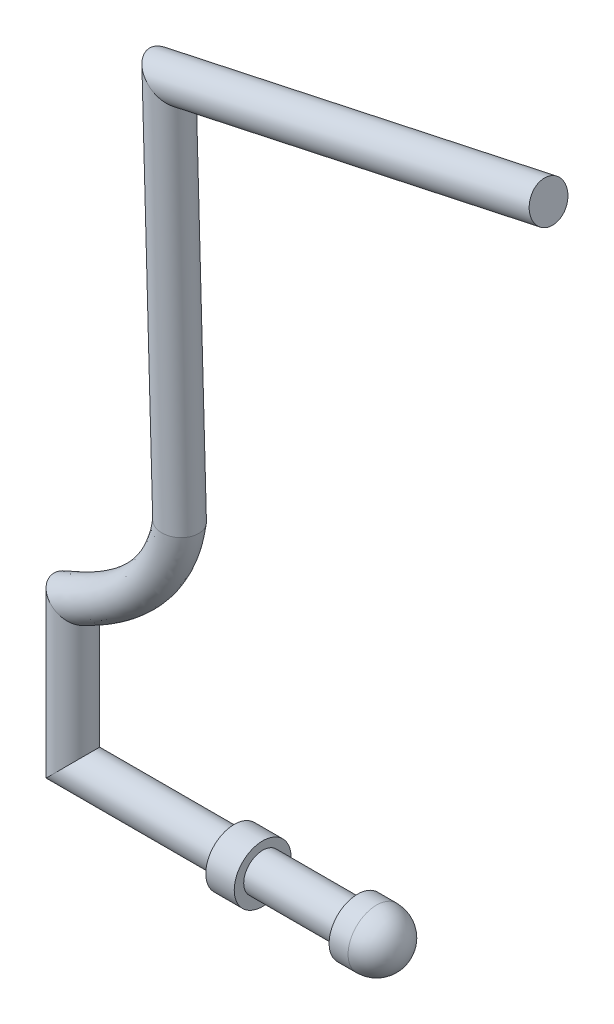
ISO-10303-21;
HEADER;
FILE_DESCRIPTION(('STEP AP214'),'2;1');
FILE_NAME('part.step','',(''),(''),'','','');
FILE_SCHEMA(('AUTOMOTIVE_DESIGN { 1 0 10303 214 1 1 1 1 }'));
ENDSEC;
DATA;
#1=APPLICATION_CONTEXT('core data for automotive mechanical design processes');
#2=APPLICATION_PROTOCOL_DEFINITION('international standard','automotive_design',2000,#1);
#3=PRODUCT_CONTEXT('',#1,'mechanical');
#4=PRODUCT('Part','Part','',(#3));
#5=PRODUCT_RELATED_PRODUCT_CATEGORY('part','',(#4));
#6=PRODUCT_DEFINITION_FORMATION('','',#4);
#7=PRODUCT_DEFINITION_CONTEXT('part definition',#1,'design');
#8=PRODUCT_DEFINITION('design','',#6,#7);
#9=PRODUCT_DEFINITION_SHAPE('','',#8);
#10=(LENGTH_UNIT() NAMED_UNIT(*) SI_UNIT(.MILLI.,.METRE.));
#11=(NAMED_UNIT(*) PLANE_ANGLE_UNIT() SI_UNIT($,.RADIAN.));
#12=(NAMED_UNIT(*) SI_UNIT($,.STERADIAN.) SOLID_ANGLE_UNIT());
#13=UNCERTAINTY_MEASURE_WITH_UNIT(LENGTH_MEASURE(1.E-05),#10,'distance_accuracy_value','');
#14=(GEOMETRIC_REPRESENTATION_CONTEXT(3) GLOBAL_UNCERTAINTY_ASSIGNED_CONTEXT((#13)) GLOBAL_UNIT_ASSIGNED_CONTEXT((#10,
#11,#12)) REPRESENTATION_CONTEXT('',''));
#15=CARTESIAN_POINT('',(0.,0.,0.));
#16=DIRECTION('',(0.,0.,1.));
#17=DIRECTION('',(1.,0.,0.));
#18=AXIS2_PLACEMENT_3D('',#15,#16,#17);
#19=CARTESIAN_POINT('',(23.0701537216067,32.6630947338033,0.));
#20=DIRECTION('',(0.977616807697375,0.210393387033894,0.));
#21=DIRECTION('',(0.,0.,1.));
#22=AXIS2_PLACEMENT_3D('',#19,#20,#21);
#23=PLANE('',#22);
#24=CARTESIAN_POINT('',(23.0701537216067,32.6630947338033,0.));
#25=DIRECTION('',(0.977616807697375,0.210393387033894,0.));
#26=DIRECTION('',(0.,0.,1.));
#27=AXIS2_PLACEMENT_3D('',#24,#25,#26);
#28=CIRCLE('',#27,2.);
#29=CARTESIAN_POINT('',(23.0701537216067,32.6630947338033,2.));
#30=VERTEX_POINT('',#29);
#31=EDGE_CURVE('E150',#30,#30,#28,.T.);
#32=ORIENTED_EDGE('',*,*,#31,.T.);
#33=EDGE_LOOP('',(#32));
#34=FACE_BOUND('',#33,.T.);
#35=ADVANCED_FACE('F57',(#34),#23,.T.);
#36=CARTESIAN_POINT('',(-31.5573984994964,-43.6047649305131,0.));
#37=DIRECTION('',(1.,0.,0.));
#38=DIRECTION('',(0.,0.,-1.));
#39=AXIS2_PLACEMENT_3D('',#36,#37,#38);
#40=CYLINDRICAL_SURFACE('',#39,2.);
#41=CARTESIAN_POINT('',(-10.0573984994964,-43.6047649305131,0.));
#42=DIRECTION('',(-1.,0.,0.));
#43=DIRECTION('',(0.,0.,1.));
#44=AXIS2_PLACEMENT_3D('',#41,#42,#43);
#45=CIRCLE('',#44,2.);
#46=CARTESIAN_POINT('',(-10.0573984994964,-43.6047649305131,2.));
#47=VERTEX_POINT('',#46);
#48=EDGE_CURVE('E61',#47,#47,#45,.T.);
#49=ORIENTED_EDGE('',*,*,#48,.T.);
#50=EDGE_LOOP('',(#49));
#51=FACE_BOUND('',#50,.T.);
#52=CARTESIAN_POINT('',(-27.0573984994964,-43.6047649305131,0.));
#53=DIRECTION('',(0.707106781186548,-0.707106781186547,0.));
#54=DIRECTION('',(-0.707106781186547,-0.707106781186548,0.));
#55=AXIS2_PLACEMENT_3D('',#52,#53,#54);
#56=ELLIPSE('',#55,2.82842712474619,2.);
#57=CARTESIAN_POINT('',(-29.0573984994964,-45.6047649305131,0.));
#58=VERTEX_POINT('',#57);
#59=EDGE_CURVE('E94',#58,#58,#56,.T.);
#60=ORIENTED_EDGE('',*,*,#59,.T.);
#61=EDGE_LOOP('',(#60));
#62=FACE_BOUND('',#61,.T.);
#63=ADVANCED_FACE('F175',(#51,#62),#40,.T.);
#64=CARTESIAN_POINT('',(-27.0573984994964,-25.6304125318188,0.));
#65=DIRECTION('',(0.,-1.,0.));
#66=DIRECTION('',(1.,0.,0.));
#67=AXIS2_PLACEMENT_3D('',#64,#65,#66);
#68=CYLINDRICAL_SURFACE('',#67,2.);
#69=CARTESIAN_POINT('',(-27.0573984994964,-28.6047649305131,2.));
#70=CARTESIAN_POINT('',(-27.0547902427945,-28.60646879431,2.00000000374567));
#71=CARTESIAN_POINT('',(-27.052181816219,-28.6081726236316,1.99999490133649));
#72=CARTESIAN_POINT('',(-26.9073391187785,-28.7027760905828,1.99942798150484));
#73=CARTESIAN_POINT('',(-26.7646487444797,-28.7955419600589,1.9836860106137));
#74=CARTESIAN_POINT('',(-26.4831926961601,-28.9777032569447,1.92123246162214));
#75=CARTESIAN_POINT('',(-26.3444421868484,-29.0670860125427,1.87441469037574));
#76=CARTESIAN_POINT('',(-26.1497182514312,-29.1920074472056,1.7834437351073));
#77=CARTESIAN_POINT('',(-26.0896780176796,-29.2304476947069,1.75162705490688));
#78=CARTESIAN_POINT('',(-25.9723056254477,-29.3054523551176,1.68144115418145));
#79=CARTESIAN_POINT('',(-25.9149727400399,-29.3420172717862,1.64307370546662));
#80=CARTESIAN_POINT('',(-25.8038819226971,-29.4127436319745,1.55996553468224));
#81=CARTESIAN_POINT('',(-25.7501130749828,-29.4469124348001,1.51524573004768));
#82=CARTESIAN_POINT('',(-25.6466503479311,-29.5125543433953,1.41942520351881));
#83=CARTESIAN_POINT('',(-25.5969607783853,-29.5440245996507,1.36831787331346));
#84=CARTESIAN_POINT('',(-25.4831641588429,-29.615991037872,1.23775721054097));
#85=CARTESIAN_POINT('',(-25.4214845808273,-29.6549067352617,1.15526586345115));
#86=CARTESIAN_POINT('',(-25.3105071123684,-29.7248124596385,0.979360181860293));
#87=CARTESIAN_POINT('',(-25.2611923278417,-29.7558133018046,0.88596100953184));
#88=CARTESIAN_POINT('',(-25.1981617941612,-29.7953908656488,0.738999855635559));
#89=CARTESIAN_POINT('',(-25.1789246796274,-29.8074610407759,0.688670307025848));
#90=CARTESIAN_POINT('',(-25.1444564774105,-29.8290770811345,0.586149648725101));
#91=CARTESIAN_POINT('',(-25.1292230058377,-29.8386244485402,0.533959667912905));
#92=CARTESIAN_POINT('',(-25.1029971871535,-29.8550552447093,0.428120031077397));
#93=CARTESIAN_POINT('',(-25.0920041697192,-29.8619390945171,0.374470607196649));
#94=CARTESIAN_POINT('',(-25.0744311575326,-29.8729409122817,0.266185392142446));
#95=CARTESIAN_POINT('',(-25.0678513057179,-29.8770587906517,0.211549569079443));
#96=CARTESIAN_POINT('',(-25.0558039902371,-29.8845982432336,0.0580431010222814));
#97=CARTESIAN_POINT('',(-25.0553836155584,-29.8848610816187,-0.0414478792052628));
#98=CARTESIAN_POINT('',(-25.0692506023283,-29.8761832519674,-0.23891077122778));
#99=CARTESIAN_POINT('',(-25.0835344622968,-29.8672447750157,-0.33688303903182));
#100=CARTESIAN_POINT('',(-25.1253006851843,-29.8410840689123,-0.525365350516722));
#101=CARTESIAN_POINT('',(-25.1523353474638,-29.8241428008789,-0.616014710211577));
#102=CARTESIAN_POINT('',(-25.2181391580587,-29.7828541568776,-0.791127453216152));
#103=CARTESIAN_POINT('',(-25.2569104895934,-29.7585054029876,-0.875589681981025));
#104=CARTESIAN_POINT('',(-25.3474248728442,-29.7015699984121,-1.04188093109738));
#105=CARTESIAN_POINT('',(-25.3998386873785,-29.6685562512125,-1.12319650852701));
#106=CARTESIAN_POINT('',(-25.514175262869,-29.5963929109345,-1.27575907309944));
#107=CARTESIAN_POINT('',(-25.5761014518406,-29.5572411057525,-1.34700241262113));
#108=CARTESIAN_POINT('',(-25.7160772650902,-29.4685420400286,-1.48724733352028));
#109=CARTESIAN_POINT('',(-25.7951763674956,-29.4183051175249,-1.55476084654591));
#110=CARTESIAN_POINT('',(-25.9606712385394,-29.3128992436027,-1.67561959196599));
#111=CARTESIAN_POINT('',(-26.0470738240835,-29.2577256815628,-1.72895139065792));
#112=CARTESIAN_POINT('',(-26.1874598597004,-29.1678099259049,-1.80182522851041));
#113=CARTESIAN_POINT('',(-26.2397820175383,-29.1342423479356,-1.82614136878645));
#114=CARTESIAN_POINT('',(-26.3457207452086,-29.0661603232583,-1.86997269083218));
#115=CARTESIAN_POINT('',(-26.3993360664092,-29.0316467858627,-1.88949231501079));
#116=CARTESIAN_POINT('',(-26.5616281808247,-28.9269917332801,-1.94089612676058));
#117=CARTESIAN_POINT('',(-26.6718669838055,-28.8556616048557,-1.96568453264903));
#118=CARTESIAN_POINT('',(-26.8714828809905,-28.7260286859704,-1.9933501789901));
#119=CARTESIAN_POINT('',(-26.9605866729952,-28.6679977130462,-1.99963655648715));
#120=CARTESIAN_POINT('',(-27.0521817630386,-28.6081726564997,-1.9999948963787));
#121=CARTESIAN_POINT('',(-27.0547901891653,-28.6064688274337,-1.99999999880639));
#122=CARTESIAN_POINT('',(-27.0573984994964,-28.6047649305131,-2.00000000000003));
#123=B_SPLINE_CURVE_WITH_KNOTS('',3,(#69,#70,#71,#72,#73,#74,#75,#76,#77,#78,#79,#80,#81,#82,
#83,#84,#85,#86,#87,#88,#89,#90,#91,#92,#93,#94,#95,#96,#97,#98,#99,#100,#101,#102,#103,#104,
#105,#106,#107,#108,#109,#110,#111,#112,#113,#114,#115,#116,#117,#118,#119,#120,#121,#122),
.UNSPECIFIED.,.F.,.F.,(4,2,2,2,2,2,2,2,2,2,2,2,2,2,2,2,2,2,2,2,2,2,2,2,2,2,4),(0.,
0.00934677387576984,0.518984244049087,1.03037229066544,1.26429747895613,1.49815949659148,
1.73126856028145,1.96462081836943,2.2935217135361,2.62197075036407,2.78742211093773,
2.95277473243839,3.11810120458854,3.28343303122495,3.58026235057503,3.87702100309811,
4.16405809425998,4.45114861203124,4.75659071031833,5.06214314145183,5.40730876943833,
5.75280020195174,5.95287686218046,6.15276751217887,6.55210387080693,6.87095712725724,
6.88030390113301),.UNSPECIFIED.);
#124=CARTESIAN_POINT('',(-27.0573984994964,-28.6047649305131,-2.00000000000003));
#125=VERTEX_POINT('',#124);
#126=CARTESIAN_POINT('',(-27.0573984994964,-28.6047649305131,2.));
#127=VERTEX_POINT('',#126);
#128=EDGE_CURVE('E83',#125,#127,#123,.F.);
#129=ORIENTED_EDGE('',*,*,#128,.T.);
#130=CARTESIAN_POINT('',(-27.0573984994964,-28.6047649305131,2.));
#131=CARTESIAN_POINT('',(-27.0600067592209,-28.6030610677344,2.00000000379901));
#132=CARTESIAN_POINT('',(-27.0626151204283,-28.6013571384644,1.99999490138962));
#133=CARTESIAN_POINT('',(-27.2075613748215,-28.506670024978,1.99942758682426));
#134=CARTESIAN_POINT('',(-27.3501532390832,-28.4135203529584,1.9836636393583));
#135=CARTESIAN_POINT('',(-27.6307800591626,-28.2301974091511,1.92143660938173));
#136=CARTESIAN_POINT('',(-27.7688086753431,-28.1400282781997,1.87493255899463));
#137=CARTESIAN_POINT('',(-27.9630384341861,-28.013145046582,1.78448885158302));
#138=CARTESIAN_POINT('',(-28.0232975126817,-27.9737799968187,1.75263961238422));
#139=CARTESIAN_POINT('',(-28.1409905063786,-27.8968955537352,1.68241301911816));
#140=CARTESIAN_POINT('',(-28.1984289522793,-27.8593732005409,1.64404660712078));
#141=CARTESIAN_POINT('',(-28.3097517227462,-27.7866502718081,1.56090497077301));
#142=CARTESIAN_POINT('',(-28.363645253069,-27.7514436824846,1.51614738774878));
#143=CARTESIAN_POINT('',(-28.4673788255117,-27.6836784918131,1.42019565521536));
#144=CARTESIAN_POINT('',(-28.5172130442888,-27.6511236946311,1.36899251796146));
#145=CARTESIAN_POINT('',(-28.6309453860486,-27.5768266876397,1.23860190353379));
#146=CARTESIAN_POINT('',(-28.6924789941246,-27.5366291255117,1.15642155311485));
#147=CARTESIAN_POINT('',(-28.8033099259034,-27.4642274995627,0.981075519414675));
#148=CARTESIAN_POINT('',(-28.8526257368905,-27.4320113587035,0.887926751962048));
#149=CARTESIAN_POINT('',(-28.9157585265055,-27.3907691120384,0.741198889836853));
#150=CARTESIAN_POINT('',(-28.9350512144618,-27.3781659338817,0.690906305084585));
#151=CARTESIAN_POINT('',(-28.9696453359075,-27.3555669120754,0.58841437255905));
#152=CARTESIAN_POINT('',(-28.9849490221523,-27.3455695967867,0.536216120068653));
#153=CARTESIAN_POINT('',(-29.0113170068859,-27.3283443967478,0.430323155600174));
#154=CARTESIAN_POINT('',(-29.0223823762976,-27.3211158124044,0.376628825329026));
#155=CARTESIAN_POINT('',(-29.0400934262315,-27.3095458581185,0.26822159473902));
#156=CARTESIAN_POINT('',(-29.0467390494945,-27.3052045255811,0.213508681233531));
#157=CARTESIAN_POINT('',(-29.0588767324449,-27.2972754396462,0.0606868081332737));
#158=CARTESIAN_POINT('',(-29.0594435910959,-27.2969051324759,-0.0380483935993854));
#159=CARTESIAN_POINT('',(-29.0460893844945,-27.3056289269857,-0.234029459070437));
#160=CARTESIAN_POINT('',(-29.0321716676264,-27.3147208412938,-0.331275661747121));
#161=CARTESIAN_POINT('',(-28.9914382281146,-27.3413304456857,-0.517956090749516));
#162=CARTESIAN_POINT('',(-28.9651187350402,-27.3585239678974,-0.607546227937021));
#163=CARTESIAN_POINT('',(-28.9010621125669,-27.4003697195647,-0.780660969501449));
#164=CARTESIAN_POINT('',(-28.8633233443699,-27.4250230195845,-0.864184701144163));
#165=CARTESIAN_POINT('',(-28.7749890816175,-27.4827284279131,-1.0291928324183));
#166=CARTESIAN_POINT('',(-28.7236821192018,-27.5162453109818,-1.11013167575773));
#167=CARTESIAN_POINT('',(-28.6117127104263,-27.5893906637475,-1.26215617220072));
#168=CARTESIAN_POINT('',(-28.5510443272541,-27.6290230117412,-1.33323551792162));
#169=CARTESIAN_POINT('',(-28.4008403512788,-27.7271455344373,-1.48666811493402));
#170=CARTESIAN_POINT('',(-28.3083945356669,-27.7875368391896,-1.56497205071805));
#171=CARTESIAN_POINT('',(-28.1137895851128,-27.9146649064276,-1.7024374614669));
#172=CARTESIAN_POINT('',(-28.0116028640379,-27.9814196902227,-1.76154234828779));
#173=CARTESIAN_POINT('',(-27.8002338733995,-28.1194993225221,-1.86061952952882));
#174=CARTESIAN_POINT('',(-27.6910114880515,-28.1908503780171,-1.90046859570425));
#175=CARTESIAN_POINT('',(-27.4690876865482,-28.3358249949021,-1.96053430987309));
#176=CARTESIAN_POINT('',(-27.3563940557754,-28.4094434708431,-1.98079199907332));
#177=CARTESIAN_POINT('',(-27.1839359246044,-28.5221034092281,-1.99687890598148));
#178=CARTESIAN_POINT('',(-27.1245782866229,-28.56087928411,-1.9997525053523));
#179=CARTESIAN_POINT('',(-27.0626152010813,-28.6013570857559,-1.99999489555306));
#180=CARTESIAN_POINT('',(-27.0600068408548,-28.6030610143944,-1.99999999799769));
#181=CARTESIAN_POINT('',(-27.0573984994964,-28.6047649305131,-2.00000000000003));
#182=B_SPLINE_CURVE_WITH_KNOTS('',3,(#130,#131,#132,#133,#134,#135,#136,#137,#138,#139,#140,
#141,#142,#143,#144,#145,#146,#147,#148,#149,#150,#151,#152,#153,#154,#155,#156,#157,#158,#159,
#160,#161,#162,#163,#164,#165,#166,#167,#168,#169,#170,#171,#172,#173,#174,#175,#176,#177,#178,
#179,#180,#181),.UNSPECIFIED.,.F.,.F.,(4,2,2,2,2,2,2,2,2,2,2,2,2,2,2,2,2,2,2,2,2,2,2,2,2,4),(0.,
0.00934677386766957,0.51938188048423,1.03009809402642,1.26594419132055,1.50139815712763,
1.73621433882631,1.97136165482287,2.30071900011833,2.62957489402601,2.79533706116633,
2.96100541169198,3.12663187406802,3.29226048214591,3.5868236225048,3.8813186841288,
4.16491848566464,4.44855900637094,4.75192048460461,5.05547514492847,5.45945084331058,
5.86460665586346,6.27232202331638,6.67918142177261,6.89187211476563,6.90121888863348),.UNSPECIFIED.);
#183=EDGE_CURVE('E85',#125,#127,#182,.F.);
#184=ORIENTED_EDGE('',*,*,#183,.F.);
#185=EDGE_LOOP('',(#129,#184));
#186=FACE_BOUND('',#185,.T.);
#187=ORIENTED_EDGE('',*,*,#59,.F.);
#188=EDGE_LOOP('',(#187));
#189=FACE_BOUND('',#188,.T.);
#190=ADVANCED_FACE('F91',(#186,#189),#68,.T.);
#191=CARTESIAN_POINT('',(-15.7383971886132,-15.4487188343818,2.));
#192=CARTESIAN_POINT('',(-15.764203303766,-15.6142541076332,2.));
#193=CARTESIAN_POINT('',(-15.7900068467324,-15.7797905486145,2.));
#194=CARTESIAN_POINT('',(-15.842756993185,-16.1181242342521,2.));
#195=CARTESIAN_POINT('',(-15.872510614899,-16.2896471389142,2.));
#196=CARTESIAN_POINT('',(-15.9376582940252,-16.6301322834237,2.));
#197=CARTESIAN_POINT('',(-15.9730496663545,-16.7990957422538,2.));
#198=CARTESIAN_POINT('',(-16.0876763816437,-17.3021487784781,2.));
#199=CARTESIAN_POINT('',(-16.1753643229012,-17.6324010155977,2.));
#200=CARTESIAN_POINT('',(-16.472238539871,-18.6078083658716,2.));
#201=CARTESIAN_POINT('',(-16.7152352087823,-19.2376141179425,2.));
#202=CARTESIAN_POINT('',(-17.5794667883026,-21.06563392984,2.));
#203=CARTESIAN_POINT('',(-18.3359432716998,-22.2024505453065,2.));
#204=CARTESIAN_POINT('',(-20.209540432609,-24.3123572580414,2.));
#205=CARTESIAN_POINT('',(-21.3266611101121,-25.2854473552928,2.));
#206=CARTESIAN_POINT('',(-23.2728252719459,-26.6222876125003,2.));
#207=CARTESIAN_POINT('',(-23.9666271834861,-27.04743521679,2.));
#208=CARTESIAN_POINT('',(-25.0749508371961,-27.6544579010648,2.));
#209=CARTESIAN_POINT('',(-25.4556621861646,-27.8516823421269,2.));
#210=CARTESIAN_POINT('',(-26.0436344062136,-28.1398443231767,2.));
#211=CARTESIAN_POINT('',(-26.2424426789979,-28.2346192034377,2.));
#212=CARTESIAN_POINT('',(-26.6456942900971,-28.4216107371106,2.));
#213=CARTESIAN_POINT('',(-26.8501397031828,-28.5138264486128,2.));
#214=CARTESIAN_POINT('',(-27.2843724084445,-28.7043537686124,2.));
#215=CARTESIAN_POINT('',(-27.5113508616479,-28.8039405436937,2.));
#216=CARTESIAN_POINT('',(-27.9653032238002,-29.003116156877,2.));
#217=CARTESIAN_POINT('',(-28.1922794048756,-29.1027039634677,2.));
#218=CARTESIAN_POINT('',(-28.8732079481039,-29.4014673832375,2.));
#219=CARTESIAN_POINT('',(-29.3271603102547,-29.6006429964188,2.));
#220=CARTESIAN_POINT('',(-29.781112672407,-29.7998186096021,2.));
#221=CARTESIAN_POINT('',(-11.7861352657886,-16.0648565571282,2.));
#222=CARTESIAN_POINT('',(-11.8119413809415,-16.2303918303801,2.));
#223=CARTESIAN_POINT('',(-11.8343906996646,-16.3744169386311,2.));
#224=CARTESIAN_POINT('',(-11.8939965152078,-16.7567174458647,2.));
#225=CARTESIAN_POINT('',(-11.9350838445952,-16.995913120141,2.));
#226=CARTESIAN_POINT('',(-12.0176236392427,-17.4272956997018,2.));
#227=CARTESIAN_POINT('',(-12.062573356106,-17.6419386581326,2.));
#228=CARTESIAN_POINT('',(-12.2085267741924,-18.2824726720513,2.));
#229=CARTESIAN_POINT('',(-12.3206449659764,-18.7049726099885,2.));
#230=CARTESIAN_POINT('',(-12.7016271129035,-19.9567242441813,2.));
#231=CARTESIAN_POINT('',(-13.0152944215247,-20.770192743683,2.));
#232=CARTESIAN_POINT('',(-14.1306571841366,-23.129404413237,2.));
#233=CARTESIAN_POINT('',(-15.107549363245,-24.5910365602624,2.));
#234=CARTESIAN_POINT('',(-17.4560202362592,-27.235710968152,2.));
#235=CARTESIAN_POINT('',(-18.8250664527826,-28.4198622331824,2.));
#236=CARTESIAN_POINT('',(-21.1264302374175,-30.0006927794378,2.));
#237=CARTESIAN_POINT('',(-21.9352113046913,-30.495487708955,2.));
#238=CARTESIAN_POINT('',(-23.2084658965455,-31.1928421484919,2.));
#239=CARTESIAN_POINT('',(-23.6429182895945,-31.4178239564302,2.));
#240=CARTESIAN_POINT('',(-24.3095040900981,-31.7445140249671,2.));
#241=CARTESIAN_POINT('',(-24.534184834543,-31.8516134369064,2.));
#242=CARTESIAN_POINT('',(-24.9885034510847,-32.0622852174197,2.));
#243=CARTESIAN_POINT('',(-25.2305689573976,-32.1713082470382,2.));
#244=CARTESIAN_POINT('',(-25.6908357429265,-32.3732587153088,2.));
#245=CARTESIAN_POINT('',(-25.9042061539615,-32.466874598322,2.));
#246=CARTESIAN_POINT('',(-26.3581585161137,-32.6660502115053,2.));
#247=CARTESIAN_POINT('',(-26.5851346971891,-32.7656380180959,2.));
#248=CARTESIAN_POINT('',(-27.2660632404175,-33.0644014378657,2.));
#249=CARTESIAN_POINT('',(-27.7200156025691,-33.2635770510471,2.));
#250=CARTESIAN_POINT('',(-28.1739679647205,-33.4627526642304,2.));
#251=CARTESIAN_POINT('',(-11.7861352657886,-16.0648565571282,-2.));
#252=CARTESIAN_POINT('',(-11.8119413809415,-16.2303918303801,-2.));
#253=CARTESIAN_POINT('',(-11.8343906996646,-16.3744169386311,-2.));
#254=CARTESIAN_POINT('',(-11.8939965152078,-16.7567174458647,-2.));
#255=CARTESIAN_POINT('',(-11.9350838445952,-16.995913120141,-2.));
#256=CARTESIAN_POINT('',(-12.0176236392427,-17.4272956997018,-2.));
#257=CARTESIAN_POINT('',(-12.062573356106,-17.6419386581326,-2.));
#258=CARTESIAN_POINT('',(-12.2085267741924,-18.2824726720513,-2.));
#259=CARTESIAN_POINT('',(-12.3206449659764,-18.7049726099885,-2.));
#260=CARTESIAN_POINT('',(-12.7016271129035,-19.9567242441813,-2.));
#261=CARTESIAN_POINT('',(-13.0152944215247,-20.770192743683,-2.));
#262=CARTESIAN_POINT('',(-14.1306571841366,-23.129404413237,-2.));
#263=CARTESIAN_POINT('',(-15.107549363245,-24.5910365602624,-2.));
#264=CARTESIAN_POINT('',(-17.4560202362592,-27.235710968152,-2.));
#265=CARTESIAN_POINT('',(-18.8250664527826,-28.4198622331824,-2.));
#266=CARTESIAN_POINT('',(-21.1264302374175,-30.0006927794378,-2.));
#267=CARTESIAN_POINT('',(-21.9352113046913,-30.495487708955,-2.));
#268=CARTESIAN_POINT('',(-23.2084658965455,-31.1928421484919,-2.));
#269=CARTESIAN_POINT('',(-23.6429182895945,-31.4178239564302,-2.));
#270=CARTESIAN_POINT('',(-24.3095040900981,-31.7445140249671,-2.));
#271=CARTESIAN_POINT('',(-24.534184834543,-31.8516134369064,-2.));
#272=CARTESIAN_POINT('',(-24.9885034510847,-32.0622852174197,-2.));
#273=CARTESIAN_POINT('',(-25.2305689573976,-32.1713082470382,-2.));
#274=CARTESIAN_POINT('',(-25.6908357429265,-32.3732587153088,-2.));
#275=CARTESIAN_POINT('',(-25.9042061539615,-32.466874598322,-2.));
#276=CARTESIAN_POINT('',(-26.3581585161137,-32.6660502115053,-2.));
#277=CARTESIAN_POINT('',(-26.5851346971891,-32.7656380180959,-2.));
#278=CARTESIAN_POINT('',(-27.2660632404175,-33.0644014378657,-2.));
#279=CARTESIAN_POINT('',(-27.7200156025691,-33.2635770510471,-2.));
#280=CARTESIAN_POINT('',(-28.1739679647205,-33.4627526642304,-2.));
#281=CARTESIAN_POINT('',(-15.7383971886132,-15.4487188343818,-2.));
#282=CARTESIAN_POINT('',(-15.764203303766,-15.6142541076332,-2.));
#283=CARTESIAN_POINT('',(-15.7900068467324,-15.7797905486145,-2.));
#284=CARTESIAN_POINT('',(-15.842756993185,-16.1181242342521,-2.));
#285=CARTESIAN_POINT('',(-15.872510614899,-16.2896471389142,-2.));
#286=CARTESIAN_POINT('',(-15.9376582940252,-16.6301322834237,-2.));
#287=CARTESIAN_POINT('',(-15.9730496663545,-16.7990957422538,-2.));
#288=CARTESIAN_POINT('',(-16.0876763816437,-17.3021487784781,-2.));
#289=CARTESIAN_POINT('',(-16.1753643229012,-17.6324010155977,-2.));
#290=CARTESIAN_POINT('',(-16.472238539871,-18.6078083658716,-2.));
#291=CARTESIAN_POINT('',(-16.7152352087823,-19.2376141179425,-2.));
#292=CARTESIAN_POINT('',(-17.5794667883026,-21.06563392984,-2.));
#293=CARTESIAN_POINT('',(-18.3359432716998,-22.2024505453065,-2.));
#294=CARTESIAN_POINT('',(-20.209540432609,-24.3123572580414,-2.));
#295=CARTESIAN_POINT('',(-21.3266611101121,-25.2854473552928,-2.));
#296=CARTESIAN_POINT('',(-23.2728252719459,-26.6222876125003,-2.));
#297=CARTESIAN_POINT('',(-23.9666271834861,-27.04743521679,-2.));
#298=CARTESIAN_POINT('',(-25.0749508371961,-27.6544579010648,-2.));
#299=CARTESIAN_POINT('',(-25.4556621861646,-27.8516823421269,-2.));
#300=CARTESIAN_POINT('',(-26.0436344062136,-28.1398443231767,-2.));
#301=CARTESIAN_POINT('',(-26.2424426789979,-28.2346192034377,-2.));
#302=CARTESIAN_POINT('',(-26.6456942900971,-28.4216107371106,-2.));
#303=CARTESIAN_POINT('',(-26.8501397031828,-28.5138264486128,-2.));
#304=CARTESIAN_POINT('',(-27.2843724084445,-28.7043537686124,-2.));
#305=CARTESIAN_POINT('',(-27.5113508616479,-28.8039405436937,-2.));
#306=CARTESIAN_POINT('',(-27.9653032238002,-29.003116156877,-2.));
#307=CARTESIAN_POINT('',(-28.1922794048756,-29.1027039634677,-2.));
#308=CARTESIAN_POINT('',(-28.8732079481039,-29.4014673832375,-2.));
#309=CARTESIAN_POINT('',(-29.3271603102547,-29.6006429964188,-2.));
#310=CARTESIAN_POINT('',(-29.781112672407,-29.7998186096021,-2.));
#311=CARTESIAN_POINT('',(-19.6906591114377,-14.8325811116354,-2.));
#312=CARTESIAN_POINT('',(-19.7164652265906,-14.9981163848864,-2.));
#313=CARTESIAN_POINT('',(-19.7456229938001,-15.1851641585979,-2.));
#314=CARTESIAN_POINT('',(-19.7915174711621,-15.4795310226394,-2.));
#315=CARTESIAN_POINT('',(-19.8099373852027,-15.5833811576874,-2.));
#316=CARTESIAN_POINT('',(-19.8576929488077,-15.8329688671456,-2.));
#317=CARTESIAN_POINT('',(-19.8835259766029,-15.9562528263751,-2.));
#318=CARTESIAN_POINT('',(-19.9668259890951,-16.3218248849048,-2.));
#319=CARTESIAN_POINT('',(-20.0300836798261,-16.559829421207,-2.));
#320=CARTESIAN_POINT('',(-20.2428499668385,-17.2588924875619,-2.));
#321=CARTESIAN_POINT('',(-20.41517599604,-17.705035492202,-2.));
#322=CARTESIAN_POINT('',(-21.0282763924686,-19.0018634464429,-2.));
#323=CARTESIAN_POINT('',(-21.5643371801546,-19.8138645303506,-2.));
#324=CARTESIAN_POINT('',(-22.9630606289588,-21.3890035479308,-2.));
#325=CARTESIAN_POINT('',(-23.8282557674416,-22.1510324774031,-2.));
#326=CARTESIAN_POINT('',(-25.4192203064743,-23.2438824455628,-2.));
#327=CARTESIAN_POINT('',(-25.998043062281,-23.5993827246249,-2.));
#328=CARTESIAN_POINT('',(-26.9414357778468,-24.1160736536377,-2.));
#329=CARTESIAN_POINT('',(-27.2684060827346,-24.2855407278236,-2.));
#330=CARTESIAN_POINT('',(-27.7777647223291,-24.5351746213862,-2.));
#331=CARTESIAN_POINT('',(-27.9507005234527,-24.6176249699691,-2.));
#332=CARTESIAN_POINT('',(-28.3028851291095,-24.7809362568015,-2.));
#333=CARTESIAN_POINT('',(-28.469710448968,-24.8563446501874,-2.));
#334=CARTESIAN_POINT('',(-28.8779090739626,-25.0354488219161,-2.));
#335=CARTESIAN_POINT('',(-29.1184955693344,-25.1410064890654,-2.));
#336=CARTESIAN_POINT('',(-29.5724479314866,-25.3401821022488,-2.));
#337=CARTESIAN_POINT('',(-29.799424112562,-25.4397699088394,-2.));
#338=CARTESIAN_POINT('',(-30.4803526557904,-25.7385333286092,-2.));
#339=CARTESIAN_POINT('',(-30.9343050179403,-25.9377089417905,-2.));
#340=CARTESIAN_POINT('',(-31.3882573800934,-26.1368845549738,-2.));
#341=CARTESIAN_POINT('',(-19.6906591114377,-14.8325811116354,2.));
#342=CARTESIAN_POINT('',(-19.7164652265906,-14.9981163848864,2.));
#343=CARTESIAN_POINT('',(-19.7456229938001,-15.1851641585979,2.));
#344=CARTESIAN_POINT('',(-19.7915174711621,-15.4795310226394,2.));
#345=CARTESIAN_POINT('',(-19.8099373852027,-15.5833811576874,2.));
#346=CARTESIAN_POINT('',(-19.8576929488077,-15.8329688671456,2.));
#347=CARTESIAN_POINT('',(-19.8835259766029,-15.9562528263751,2.));
#348=CARTESIAN_POINT('',(-19.9668259890951,-16.3218248849048,2.));
#349=CARTESIAN_POINT('',(-20.0300836798261,-16.559829421207,2.));
#350=CARTESIAN_POINT('',(-20.2428499668385,-17.2588924875619,2.));
#351=CARTESIAN_POINT('',(-20.41517599604,-17.705035492202,2.));
#352=CARTESIAN_POINT('',(-21.0282763924686,-19.0018634464429,2.));
#353=CARTESIAN_POINT('',(-21.5643371801546,-19.8138645303506,2.));
#354=CARTESIAN_POINT('',(-22.9630606289588,-21.3890035479308,2.));
#355=CARTESIAN_POINT('',(-23.8282557674416,-22.1510324774031,2.));
#356=CARTESIAN_POINT('',(-25.4192203064743,-23.2438824455628,2.));
#357=CARTESIAN_POINT('',(-25.998043062281,-23.5993827246249,2.));
#358=CARTESIAN_POINT('',(-26.9414357778468,-24.1160736536377,2.));
#359=CARTESIAN_POINT('',(-27.2684060827346,-24.2855407278236,2.));
#360=CARTESIAN_POINT('',(-27.7777647223291,-24.5351746213862,2.));
#361=CARTESIAN_POINT('',(-27.9507005234527,-24.6176249699691,2.));
#362=CARTESIAN_POINT('',(-28.3028851291095,-24.7809362568015,2.));
#363=CARTESIAN_POINT('',(-28.469710448968,-24.8563446501874,2.));
#364=CARTESIAN_POINT('',(-28.8779090739626,-25.0354488219161,2.));
#365=CARTESIAN_POINT('',(-29.1184955693344,-25.1410064890654,2.));
#366=CARTESIAN_POINT('',(-29.5724479314866,-25.3401821022488,2.));
#367=CARTESIAN_POINT('',(-29.799424112562,-25.4397699088394,2.));
#368=CARTESIAN_POINT('',(-30.4803526557904,-25.7385333286092,2.));
#369=CARTESIAN_POINT('',(-30.9343050179403,-25.9377089417905,2.));
#370=CARTESIAN_POINT('',(-31.3882573800934,-26.1368845549738,2.));
#371=CARTESIAN_POINT('',(-15.7383971886132,-15.4487188343818,2.));
#372=CARTESIAN_POINT('',(-15.764203303766,-15.6142541076332,2.));
#373=CARTESIAN_POINT('',(-15.7900068467324,-15.7797905486145,2.));
#374=CARTESIAN_POINT('',(-15.842756993185,-16.1181242342521,2.));
#375=CARTESIAN_POINT('',(-15.872510614899,-16.2896471389142,2.));
#376=CARTESIAN_POINT('',(-15.9376582940252,-16.6301322834237,2.));
#377=CARTESIAN_POINT('',(-15.9730496663545,-16.7990957422538,2.));
#378=CARTESIAN_POINT('',(-16.0876763816437,-17.3021487784781,2.));
#379=CARTESIAN_POINT('',(-16.1753643229012,-17.6324010155977,2.));
#380=CARTESIAN_POINT('',(-16.472238539871,-18.6078083658716,2.));
#381=CARTESIAN_POINT('',(-16.7152352087823,-19.2376141179425,2.));
#382=CARTESIAN_POINT('',(-17.5794667883026,-21.06563392984,2.));
#383=CARTESIAN_POINT('',(-18.3359432716998,-22.2024505453065,2.));
#384=CARTESIAN_POINT('',(-20.209540432609,-24.3123572580414,2.));
#385=CARTESIAN_POINT('',(-21.3266611101121,-25.2854473552928,2.));
#386=CARTESIAN_POINT('',(-23.2728252719459,-26.6222876125003,2.));
#387=CARTESIAN_POINT('',(-23.9666271834861,-27.04743521679,2.));
#388=CARTESIAN_POINT('',(-25.0749508371961,-27.6544579010648,2.));
#389=CARTESIAN_POINT('',(-25.4556621861646,-27.8516823421269,2.));
#390=CARTESIAN_POINT('',(-26.0436344062136,-28.1398443231767,2.));
#391=CARTESIAN_POINT('',(-26.2424426789979,-28.2346192034377,2.));
#392=CARTESIAN_POINT('',(-26.6456942900971,-28.4216107371106,2.));
#393=CARTESIAN_POINT('',(-26.8501397031828,-28.5138264486128,2.));
#394=CARTESIAN_POINT('',(-27.2843724084445,-28.7043537686124,2.));
#395=CARTESIAN_POINT('',(-27.5113508616479,-28.8039405436937,2.));
#396=CARTESIAN_POINT('',(-27.9653032238002,-29.003116156877,2.));
#397=CARTESIAN_POINT('',(-28.1922794048756,-29.1027039634677,2.));
#398=CARTESIAN_POINT('',(-28.8732079481039,-29.4014673832375,2.));
#399=CARTESIAN_POINT('',(-29.3271603102547,-29.6006429964188,2.));
#400=CARTESIAN_POINT('',(-29.781112672407,-29.7998186096021,2.));
#401=(BOUNDED_SURFACE() B_SPLINE_SURFACE(3,3,((#191,#192,#193,#194,#195,#196,#197,#198,#199,
#200,#201,#202,#203,#204,#205,#206,#207,#208,#209,#210,#211,#212,#213,#214,#215,#216,#217,#218,
#219,#220),(#221,#222,#223,#224,#225,#226,#227,#228,#229,#230,#231,#232,#233,#234,#235,#236,
#237,#238,#239,#240,#241,#242,#243,#244,#245,#246,#247,#248,#249,#250),(#251,#252,#253,#254,
#255,#256,#257,#258,#259,#260,#261,#262,#263,#264,#265,#266,#267,#268,#269,#270,#271,#272,#273,
#274,#275,#276,#277,#278,#279,#280),(#281,#282,#283,#284,#285,#286,#287,#288,#289,#290,#291,
#292,#293,#294,#295,#296,#297,#298,#299,#300,#301,#302,#303,#304,#305,#306,#307,#308,#309,#310),
(#311,#312,#313,#314,#315,#316,#317,#318,#319,#320,#321,#322,#323,#324,#325,#326,#327,#328,#329,
#330,#331,#332,#333,#334,#335,#336,#337,#338,#339,#340),(#341,#342,#343,#344,#345,#346,#347,
#348,#349,#350,#351,#352,#353,#354,#355,#356,#357,#358,#359,#360,#361,#362,#363,#364,#365,#366,
#367,#368,#369,#370),(#371,#372,#373,#374,#375,#376,#377,#378,#379,#380,#381,#382,#383,#384,
#385,#386,#387,#388,#389,#390,#391,#392,#393,#394,#395,#396,#397,#398,#399,#400)),.UNSPECIFIED.,
.T.,.F.,.F.) B_SPLINE_SURFACE_WITH_KNOTS((4,3,4),(4,2,2,2,2,2,2,2,2,2,2,2,2,2,4),(0.,0.5,1.),
(-0.0299360727263687,0.,0.03125,0.0625,0.125,0.25,0.5,0.75,0.875,0.9375,0.96875,1.,
1.03422259889948,1.06844519779896,1.13689039559792),
.UNSPECIFIED.) GEOMETRIC_REPRESENTATION_ITEM() RATIONAL_B_SPLINE_SURFACE(((1.,1.,1.,1.,1.,1.,1.,
1.,1.,1.,1.,1.,1.,1.,1.,1.,1.,1.,1.,1.,1.,1.,1.,1.,1.,1.,1.,1.,1.,1.),(0.333333333333333,
0.333333333333333,0.333333333333333,0.333333333333333,0.333333333333333,0.333333333333333,
0.333333333333333,0.333333333333333,0.333333333333333,0.333333333333333,0.333333333333333,
0.333333333333333,0.333333333333333,0.333333333333333,0.333333333333333,0.333333333333333,
0.333333333333333,0.333333333333333,0.333333333333333,0.333333333333333,0.333333333333333,
0.333333333333333,0.333333333333333,0.333333333333333,0.333333333333333,0.333333333333333,
0.333333333333333,0.333333333333333,0.333333333333333,0.333333333333333),(0.333333333333333,
0.333333333333333,0.333333333333333,0.333333333333333,0.333333333333333,0.333333333333333,
0.333333333333333,0.333333333333333,0.333333333333333,0.333333333333333,0.333333333333333,
0.333333333333333,0.333333333333333,0.333333333333333,0.333333333333333,0.333333333333333,
0.333333333333333,0.333333333333333,0.333333333333333,0.333333333333333,0.333333333333333,
0.333333333333333,0.333333333333333,0.333333333333333,0.333333333333333,0.333333333333333,
0.333333333333333,0.333333333333333,0.333333333333333,0.333333333333333),(1.,1.,1.,1.,1.,1.,1.,
1.,1.,1.,1.,1.,1.,1.,1.,1.,1.,1.,1.,1.,1.,1.,1.,1.,1.,1.,1.,1.,1.,1.),(0.333333333333333,
0.333333333333333,0.333333333333333,0.333333333333333,0.333333333333333,0.333333333333333,
0.333333333333333,0.333333333333333,0.333333333333333,0.333333333333333,0.333333333333333,
0.333333333333333,0.333333333333333,0.333333333333333,0.333333333333333,0.333333333333333,
0.333333333333333,0.333333333333333,0.333333333333333,0.333333333333333,0.333333333333333,
0.333333333333333,0.333333333333333,0.333333333333333,0.333333333333333,0.333333333333333,
0.333333333333333,0.333333333333333,0.333333333333333,0.333333333333333),(0.333333333333333,
0.333333333333333,0.333333333333333,0.333333333333333,0.333333333333333,0.333333333333333,
0.333333333333333,0.333333333333333,0.333333333333333,0.333333333333333,0.333333333333333,
0.333333333333333,0.333333333333333,0.333333333333333,0.333333333333333,0.333333333333333,
0.333333333333333,0.333333333333333,0.333333333333333,0.333333333333333,0.333333333333333,
0.333333333333333,0.333333333333333,0.333333333333333,0.333333333333333,0.333333333333333,
0.333333333333333,0.333333333333333,0.333333333333333,0.333333333333333),(1.,1.,1.,1.,1.,1.,1.,
1.,1.,1.,1.,1.,1.,1.,1.,1.,1.,1.,1.,1.,1.,1.,1.,1.,1.,1.,1.,1.,1.,1.))) REPRESENTATION_ITEM('') SURFACE());
#402=CARTESIAN_POINT('',(-15.8158155340719,-15.9453246541345,-2.));
#403=CARTESIAN_POINT('',(-15.8227994157063,-15.944881202447,-2.00000005050531));
#404=CARTESIAN_POINT('',(-15.8297836974226,-15.9444375072254,-1.99996361680952));
#405=CARTESIAN_POINT('',(-15.8932007572367,-15.9404067946662,-1.99930170298028));
#406=CARTESIAN_POINT('',(-15.9496312778257,-15.9368059461568,-1.99633206302202));
#407=CARTESIAN_POINT('',(-16.0620559743615,-15.92960434966,-1.98565004792635));
#408=CARTESIAN_POINT('',(-16.1180499242445,-15.9260036025771,-1.97793536204131));
#409=CARTESIAN_POINT('',(-16.2293152733145,-15.9188216033572,-1.95779145211393));
#410=CARTESIAN_POINT('',(-16.2845848839049,-15.9152404089187,-1.94535224291272));
#411=CARTESIAN_POINT('',(-16.3939079638011,-15.9081308206973,-1.91584529009256));
#412=CARTESIAN_POINT('',(-16.4479604666046,-15.9046024695734,-1.89877399942815));
#413=CARTESIAN_POINT('',(-16.6074645371684,-15.8941532348799,-1.84085189347903));
#414=CARTESIAN_POINT('',(-16.7105541722139,-15.8873493347421,-1.79323976341273));
#415=CARTESIAN_POINT('',(-16.9072573769491,-15.874281450897,-1.68129537649255));
#416=CARTESIAN_POINT('',(-17.0008706735544,-15.86801748275,-1.61696263798293));
#417=CARTESIAN_POINT('',(-17.1320520572694,-15.8591879276156,-1.509424842961));
#418=CARTESIAN_POINT('',(-17.174231318847,-15.8563396956602,-1.47174845048923));
#419=CARTESIAN_POINT('',(-17.2552246918638,-15.850854955136,-1.39300015365825));
#420=CARTESIAN_POINT('',(-17.2940420090073,-15.8482182450565,-1.35193155853185));
#421=CARTESIAN_POINT('',(-17.4051044421986,-15.8406543314949,-1.22396038761178));
#422=CARTESIAN_POINT('',(-17.4719867829723,-15.8360715401721,-1.13227046798495));
#423=CARTESIAN_POINT('',(-17.5890425321544,-15.8280191050736,-0.939334617031084));
#424=CARTESIAN_POINT('',(-17.6392853244977,-15.8245448412142,-0.838130685433198));
#425=CARTESIAN_POINT('',(-17.7220332727152,-15.8188078542911,-0.628668893782601));
#426=CARTESIAN_POINT('',(-17.7545392465705,-15.8165450753565,-0.520411359283534));
#427=CARTESIAN_POINT('',(-17.800747573684,-15.8133247957672,-0.300414641598758));
#428=CARTESIAN_POINT('',(-17.8145281558382,-15.8123618648609,-0.188691950038852));
#429=CARTESIAN_POINT('',(-17.8231406384158,-15.8117603190269,0.035484272492399));
#430=CARTESIAN_POINT('',(-17.8179728231217,-15.8121216842307,0.147937792473871));
#431=CARTESIAN_POINT('',(-17.7888669773617,-15.8141529014518,0.370138527731256));
#432=CARTESIAN_POINT('',(-17.7649683354519,-15.8158200076562,0.479890924181721));
#433=CARTESIAN_POINT('',(-17.6991587765031,-15.8203951109799,0.693813270285344));
#434=CARTESIAN_POINT('',(-17.6572475670192,-15.8233031282462,0.797983129271765));
#435=CARTESIAN_POINT('',(-17.5565181103007,-15.8302598052436,0.997979762821558));
#436=CARTESIAN_POINT('',(-17.4976797215461,-15.8343098237183,1.09379641994033));
#437=CARTESIAN_POINT('',(-17.3981529330342,-15.8411220529507,1.22900648444661));
#438=CARTESIAN_POINT('',(-17.3630924580468,-15.8435161162903,1.27266381675457));
#439=CARTESIAN_POINT('',(-17.2894141692091,-15.8485327886827,1.35692652328731));
#440=CARTESIAN_POINT('',(-17.2507930181885,-15.8511556120094,1.3975289683235));
#441=CARTESIAN_POINT('',(-17.1297815597078,-15.8593485675199,1.51448890710889));
#442=CARTESIAN_POINT('',(-17.0424078505835,-15.8652318838815,1.58577578858003));
#443=CARTESIAN_POINT('',(-16.8569839903632,-15.8776311227543,1.71269107763869));
#444=CARTESIAN_POINT('',(-16.7589336701217,-15.8841470552876,1.76831923710089));
#445=CARTESIAN_POINT('',(-16.6055873646792,-15.8942641025736,1.8390746394853));
#446=CARTESIAN_POINT('',(-16.5531563853365,-15.8977112499657,1.86061857453885));
#447=CARTESIAN_POINT('',(-16.4466992898626,-15.9046848375558,1.8991855569865));
#448=CARTESIAN_POINT('',(-16.3926745856372,-15.9082112069462,1.91621247989567));
#449=CARTESIAN_POINT('',(-16.2834747099201,-15.9153124270617,1.94561690835851));
#450=CARTESIAN_POINT('',(-16.2283015426659,-15.9188871900511,1.95800189677044));
#451=CARTESIAN_POINT('',(-16.1171187138744,-15.9260635561047,1.97807658252647));
#452=CARTESIAN_POINT('',(-16.0611091587243,-15.9296651557265,1.9857668719041));
#453=CARTESIAN_POINT('',(-15.9489880178252,-15.9368469941002,1.99636604417911));
#454=CARTESIAN_POINT('',(-15.8928793565492,-15.9404272227235,1.99930508317469));
#455=CARTESIAN_POINT('',(-15.8297837056695,-15.9444375066746,1.99996361353904));
#456=CARTESIAN_POINT('',(-15.8227994246914,-15.9448812018461,2.00000004686004));
#457=CARTESIAN_POINT('',(-15.8158155340719,-15.9453246541346,2.));
#458=B_SPLINE_CURVE_WITH_KNOTS('',3,(#402,#403,#404,#405,#406,#407,#408,#409,#410,#411,#412,
#413,#414,#415,#416,#417,#418,#419,#420,#421,#422,#423,#424,#425,#426,#427,#428,#429,#430,#431,
#432,#433,#434,#435,#436,#437,#438,#439,#440,#441,#442,#443,#444,#445,#446,#447,#448,#449,#450,
#451,#452,#453,#454,#455,#456,#457),.UNSPECIFIED.,.F.,.F.,(4,2,2,2,2,2,2,2,2,2,2,2,2,2,2,2,2,2,
2,2,2,2,2,2,2,2,2,4),(0.,0.0209949312589498,0.190634278500094,0.36035630237512,
0.530439043623819,0.700652396166216,1.0401997646056,1.3797569151692,1.54946226299129,
1.71900396852666,2.05798476064892,2.39553372454791,2.73306712015359,3.06918602490518,
3.40529988689214,3.74070883422589,4.07612322733134,4.4119383899479,4.57990109948264,
4.74802286070116,5.08508848146549,5.42215944301083,5.59235780397853,5.76240966204849,
5.93218620312944,6.10194132980646,6.2706147325893,6.29160966384825),.UNSPECIFIED.);
#459=CARTESIAN_POINT('',(-15.8158155340719,-15.9453246541346,2.));
#460=VERTEX_POINT('',#459);
#461=CARTESIAN_POINT('',(-15.8158155340719,-15.9453246541345,-2.));
#462=VERTEX_POINT('',#461);
#463=EDGE_CURVE('E143',#460,#462,#458,.F.);
#464=CARTESIAN_POINT('',(-15.8158155340719,-15.9453246541345,-2.));
#465=CARTESIAN_POINT('',(-15.8088316524961,-15.94576810644,-2.00000005050209));
#466=CARTESIAN_POINT('',(-15.8018473569737,-15.9462115846338,-1.99996361680334));
#467=CARTESIAN_POINT('',(-15.7384494068349,-15.9502371278644,-1.99930189946158));
#468=CARTESIAN_POINT('',(-15.6820371254522,-15.953819080517,-1.99633404980334));
#469=CARTESIAN_POINT('',(-15.5696468115311,-15.9609553653098,-1.98565813969495));
#470=CARTESIAN_POINT('',(-15.5136690037421,-15.9645096831562,-1.97794777252199));
#471=CARTESIAN_POINT('',(-15.402433900047,-15.9715725261378,-1.95781442048222));
#472=CARTESIAN_POINT('',(-15.3471783860911,-15.975080938035,-1.94538146545773));
#473=CARTESIAN_POINT('',(-15.237881360674,-15.9820206396351,-1.91588838610444));
#474=CARTESIAN_POINT('',(-15.1838408145973,-15.985451868011,-1.89882471388284));
#475=CARTESIAN_POINT('',(-15.0243681807056,-15.9955773041877,-1.84092623149559));
#476=CARTESIAN_POINT('',(-14.9212952362142,-16.002121667633,-1.79333119285003));
#477=CARTESIAN_POINT('',(-14.724620582073,-16.0146089316027,-1.68142253484173));
#478=CARTESIAN_POINT('',(-14.6310191394682,-16.0205518151688,-1.61710844427496));
#479=CARTESIAN_POINT('',(-14.4998621626587,-16.0288790914953,-1.50960787027933));
#480=CARTESIAN_POINT('',(-14.4576959151169,-16.0315562544949,-1.47194976308528));
#481=CARTESIAN_POINT('',(-14.376726423657,-16.0366970442383,-1.39324029912448));
#482=CARTESIAN_POINT('',(-14.3379199757916,-16.0391608744192,-1.35219224970963));
#483=CARTESIAN_POINT('',(-14.2268865672019,-16.0462103903332,-1.22428635391531));
#484=CARTESIAN_POINT('',(-14.1600188871361,-16.0504557937408,-1.13264487748394));
#485=CARTESIAN_POINT('',(-14.0429674021002,-16.057887318344,-0.939796381350611));
#486=CARTESIAN_POINT('',(-13.9927174959918,-16.0610776363938,-0.838629367928025));
#487=CARTESIAN_POINT('',(-13.9099438710777,-16.0663328411467,-0.629246085626003));
#488=CARTESIAN_POINT('',(-13.8774193982976,-16.0683977757193,-0.521030116802264));
#489=CARTESIAN_POINT('',(-13.8311463604793,-16.0713355850347,-0.301056903992963));
#490=CARTESIAN_POINT('',(-13.817329738826,-16.0722127806103,-0.18931401752393));
#491=CARTESIAN_POINT('',(-13.8086495095681,-16.0727638749164,0.0349079227958586));
#492=CARTESIAN_POINT('',(-13.8137856728872,-16.0724377881905,0.147386967732507));
#493=CARTESIAN_POINT('',(-13.8428396626167,-16.0705931940406,0.369685698148766));
#494=CARTESIAN_POINT('',(-13.8667248277785,-16.0690767602321,0.479509666222502));
#495=CARTESIAN_POINT('',(-13.9325298042491,-16.0648988866715,0.693576369784952));
#496=CARTESIAN_POINT('',(-13.9744498378076,-16.0622374328088,0.797819036475601));
#497=CARTESIAN_POINT('',(-14.0752108902174,-16.0558402026949,0.997935528288153));
#498=CARTESIAN_POINT('',(-14.1340684548578,-16.0521033759426,1.09380105005713));
#499=CARTESIAN_POINT('',(-14.2336379394822,-16.0457817394225,1.22907909305885));
#500=CARTESIAN_POINT('',(-14.2687151541902,-16.0435546920816,1.27275837750411));
#501=CARTESIAN_POINT('',(-14.3424315428696,-16.0388744342117,1.35706251524242));
#502=CARTESIAN_POINT('',(-14.3810740917049,-16.0364210093986,1.39768440706259));
#503=CARTESIAN_POINT('',(-14.5024508654937,-16.0287147411366,1.51498186627678));
#504=CARTESIAN_POINT('',(-14.5902236771866,-16.0231419688492,1.58653208295155));
#505=CARTESIAN_POINT('',(-14.7765241548342,-16.011313483197,1.71383030633622));
#506=CARTESIAN_POINT('',(-14.8750519269387,-16.0050577630915,1.76957815705957));
#507=CARTESIAN_POINT('',(-15.0287525138618,-15.9952989120578,1.84021385292985));
#508=CARTESIAN_POINT('',(-15.0810330723765,-15.9919794667406,1.86161148720454));
#509=CARTESIAN_POINT('',(-15.187171500068,-15.9852403910851,1.89991382620149));
#510=CARTESIAN_POINT('',(-15.2410279588467,-15.9818208503292,1.91682241974858));
#511=CARTESIAN_POINT('',(-15.3498771627555,-15.9749095812739,1.94602023303631));
#512=CARTESIAN_POINT('',(-15.4048679220939,-15.9714179791255,1.95831690455527));
#513=CARTESIAN_POINT('',(-15.5156756556865,-15.9643822707455,1.97824655753904));
#514=CARTESIAN_POINT('',(-15.5714925278221,-15.9608381710034,1.98588011057662));
#515=CARTESIAN_POINT('',(-15.6831622116202,-15.9537476420771,1.99639323216802));
#516=CARTESIAN_POINT('',(-15.7390116571185,-15.9502014269815,1.99930779657215));
#517=CARTESIAN_POINT('',(-15.8018473465927,-15.946211585293,1.999963613117));
#518=CARTESIAN_POINT('',(-15.8088316413239,-15.9457681071494,2.00000004641151));
#519=CARTESIAN_POINT('',(-15.8158155340719,-15.9453246541346,2.));
#520=B_SPLINE_CURVE_WITH_KNOTS('',3,(#464,#465,#466,#467,#468,#469,#470,#471,#472,#473,#474,
#475,#476,#477,#478,#479,#480,#481,#482,#483,#484,#485,#486,#487,#488,#489,#490,#491,#492,#493,
#494,#495,#496,#497,#498,#499,#500,#501,#502,#503,#504,#505,#506,#507,#508,#509,#510,#511,#512,
#513,#514,#515,#516,#517,#518,#519),.UNSPECIFIED.,.F.,.F.,(4,2,2,2,2,2,2,2,2,2,2,2,2,2,2,2,2,2,
2,2,2,2,2,2,2,2,2,4),(0.,0.0209949312521077,0.190576082323709,0.360239781616053,
0.530263677737599,0.700418209771808,1.03985296916221,1.37929729610274,1.54891216523825,
1.71836346379136,2.05716380326244,2.39459980324855,2.73202144883664,3.06821227243071,
3.40439903261019,3.74000144291247,4.07560798907519,4.41154349908009,4.57956790271037,
4.74775301887946,5.08617426833618,5.42459885826277,5.59419350285554,5.7636407458111,
5.93281301026607,6.10196453459371,6.2698557945029,6.290850725755),.UNSPECIFIED.);
#521=EDGE_CURVE('E75',#460,#462,#520,.F.);
#522=ORIENTED_EDGE('',*,*,#183,.T.);
#523=ORIENTED_EDGE('',*,*,#128,.F.);
#524=EDGE_LOOP('',(#522,#523));
#525=FACE_BOUND('',#524,.T.);
#526=ORIENTED_EDGE('',*,*,#463,.T.);
#527=ORIENTED_EDGE('',*,*,#521,.F.);
#528=EDGE_LOOP('',(#526,#527));
#529=FACE_BOUND('',#528,.T.);
#530=ADVANCED_FACE('F86',(#525,#529),#401,.F.);
#531=CARTESIAN_POINT('',(-17.0344184807678,27.8094084322751,0.));
#532=DIRECTION('',(0.0278399734501382,-0.999612392819485,0.));
#533=DIRECTION('',(0.999612392819485,0.0278399734501382,0.));
#534=AXIS2_PLACEMENT_3D('',#531,#532,#533);
#535=CYLINDRICAL_SURFACE('',#534,2.);
#536=ORIENTED_EDGE('',*,*,#521,.T.);
#537=ORIENTED_EDGE('',*,*,#463,.F.);
#538=EDGE_LOOP('',(#536,#537));
#539=FACE_BOUND('',#538,.T.);
#540=CARTESIAN_POINT('',(-16.9298462783933,24.0546753458657,0.));
#541=DIRECTION('',(-0.617442846335979,-0.786615745779682,0.));
#542=DIRECTION('',(-0.786615745779682,0.617442846335979,0.));
#543=AXIS2_PLACEMENT_3D('',#540,#541,#542);
#544=ELLIPSE('',#543,2.60037020938859,2.);
#545=CARTESIAN_POINT('',(-18.9753384299548,25.6602553294779,0.));
#546=VERTEX_POINT('',#545);
#547=EDGE_CURVE('E151',#546,#546,#544,.T.);
#548=ORIENTED_EDGE('',*,*,#547,.T.);
#549=EDGE_LOOP('',(#548));
#550=FACE_BOUND('',#549,.T.);
#551=ADVANCED_FACE('F119',(#539,#550),#535,.T.);
#552=CARTESIAN_POINT('',(23.0701537216067,32.6630947338033,0.));
#553=DIRECTION('',(-0.977616807697375,-0.210393387033894,0.));
#554=DIRECTION('',(0.210393387033894,-0.977616807697375,0.));
#555=AXIS2_PLACEMENT_3D('',#552,#553,#554);
#556=CYLINDRICAL_SURFACE('',#555,2.);
#557=ORIENTED_EDGE('',*,*,#31,.F.);
#558=EDGE_LOOP('',(#557));
#559=FACE_BOUND('',#558,.T.);
#560=ORIENTED_EDGE('',*,*,#547,.F.);
#561=EDGE_LOOP('',(#560));
#562=FACE_BOUND('',#561,.T.);
#563=ADVANCED_FACE('F189',(#559,#562),#556,.T.);
#564=CARTESIAN_POINT('',(-10.0573984994964,-43.7412555242453,0.));
#565=DIRECTION('',(1.,0.,0.));
#566=DIRECTION('',(0.,0.,-1.));
#567=AXIS2_PLACEMENT_3D('',#564,#565,#566);
#568=CYLINDRICAL_SURFACE('',#567,3.);
#569=CARTESIAN_POINT('',(-10.0573984994964,-43.7412555242453,0.));
#570=DIRECTION('',(-1.,0.,0.));
#571=DIRECTION('',(0.,0.,1.));
#572=AXIS2_PLACEMENT_3D('',#569,#570,#571);
#573=CIRCLE('',#572,3.);
#574=CARTESIAN_POINT('',(-10.0573984994964,-43.7412555242453,3.));
#575=VERTEX_POINT('',#574);
#576=EDGE_CURVE('E166',#575,#575,#573,.T.);
#577=ORIENTED_EDGE('',*,*,#576,.F.);
#578=EDGE_LOOP('',(#577));
#579=FACE_BOUND('',#578,.T.);
#580=CARTESIAN_POINT('',(-7.05739849949637,-43.7412555242453,0.));
#581=DIRECTION('',(-1.,0.,0.));
#582=DIRECTION('',(0.,0.,1.));
#583=AXIS2_PLACEMENT_3D('',#580,#581,#582);
#584=CIRCLE('',#583,3.);
#585=CARTESIAN_POINT('',(-7.05739849949637,-43.7412555242453,3.));
#586=VERTEX_POINT('',#585);
#587=EDGE_CURVE('E162',#586,#586,#584,.T.);
#588=ORIENTED_EDGE('',*,*,#587,.T.);
#589=EDGE_LOOP('',(#588));
#590=FACE_BOUND('',#589,.T.);
#591=ADVANCED_FACE('F181',(#579,#590),#568,.T.);
#592=CARTESIAN_POINT('',(-10.0573984994964,-43.7412555242453,0.));
#593=DIRECTION('',(-1.,0.,0.));
#594=DIRECTION('',(0.,0.,1.));
#595=AXIS2_PLACEMENT_3D('',#592,#593,#594);
#596=PLANE('',#595);
#597=ORIENTED_EDGE('',*,*,#48,.F.);
#598=EDGE_LOOP('',(#597));
#599=FACE_BOUND('',#598,.T.);
#600=ORIENTED_EDGE('',*,*,#576,.T.);
#601=EDGE_LOOP('',(#600));
#602=FACE_BOUND('',#601,.T.);
#603=ADVANCED_FACE('F178',(#599,#602),#596,.T.);
#604=CARTESIAN_POINT('',(-7.05739849949637,-43.7412555242453,0.));
#605=DIRECTION('',(-1.,0.,0.));
#606=DIRECTION('',(0.,0.,1.));
#607=AXIS2_PLACEMENT_3D('',#604,#605,#606);
#608=PLANE('',#607);
#609=CARTESIAN_POINT('',(-7.05739849949637,-43.6047649305131,0.));
#610=DIRECTION('',(-1.,0.,0.));
#611=DIRECTION('',(0.,0.,1.));
#612=AXIS2_PLACEMENT_3D('',#609,#610,#611);
#613=CIRCLE('',#612,2.);
#614=CARTESIAN_POINT('',(-7.05739849949637,-43.6047649305131,2.));
#615=VERTEX_POINT('',#614);
#616=EDGE_CURVE('E12',#615,#615,#613,.T.);
#617=ORIENTED_EDGE('',*,*,#616,.T.);
#618=EDGE_LOOP('',(#617));
#619=FACE_BOUND('',#618,.T.);
#620=ORIENTED_EDGE('',*,*,#587,.F.);
#621=EDGE_LOOP('',(#620));
#622=FACE_BOUND('',#621,.T.);
#623=ADVANCED_FACE('F180',(#619,#622),#608,.F.);
#624=CARTESIAN_POINT('',(4.94260150050363,-43.6047649305131,0.));
#625=DIRECTION('',(1.,0.,0.));
#626=DIRECTION('',(0.,0.,-1.));
#627=AXIS2_PLACEMENT_3D('',#624,#625,#626);
#628=SPHERICAL_SURFACE('',#627,3.);
#629=CARTESIAN_POINT('',(4.94260150050363,-43.6047649305131,0.));
#630=DIRECTION('',(-1.,0.,0.));
#631=DIRECTION('',(0.,0.,1.));
#632=AXIS2_PLACEMENT_3D('',#629,#630,#631);
#633=CIRCLE('',#632,3.);
#634=CARTESIAN_POINT('',(4.94260150050363,-43.6047649305131,3.));
#635=VERTEX_POINT('',#634);
#636=EDGE_CURVE('E68',#635,#635,#633,.T.);
#637=ORIENTED_EDGE('',*,*,#636,.F.);
#638=EDGE_LOOP('',(#637));
#639=FACE_BOUND('',#638,.T.);
#640=ADVANCED_FACE('F59',(#639),#628,.T.);
#641=CARTESIAN_POINT('',(7.94260150050363,-43.6047649305131,0.));
#642=DIRECTION('',(-1.,0.,0.));
#643=DIRECTION('',(0.,0.,1.));
#644=AXIS2_PLACEMENT_3D('',#641,#642,#643);
#645=CYLINDRICAL_SURFACE('',#644,3.);
#646=ORIENTED_EDGE('',*,*,#636,.T.);
#647=EDGE_LOOP('',(#646));
#648=FACE_BOUND('',#647,.T.);
#649=CARTESIAN_POINT('',(2.94260150050363,-43.6047649305131,0.));
#650=DIRECTION('',(1.,0.,0.));
#651=DIRECTION('',(0.,0.,-1.));
#652=AXIS2_PLACEMENT_3D('',#649,#650,#651);
#653=CIRCLE('',#652,3.);
#654=CARTESIAN_POINT('',(2.94260150050363,-43.6047649305131,-3.));
#655=VERTEX_POINT('',#654);
#656=EDGE_CURVE('E158',#655,#655,#653,.T.);
#657=ORIENTED_EDGE('',*,*,#656,.T.);
#658=EDGE_LOOP('',(#657));
#659=FACE_BOUND('',#658,.T.);
#660=ADVANCED_FACE('F201',(#648,#659),#645,.T.);
#661=CARTESIAN_POINT('',(2.94260150050363,-43.6047649305131,0.));
#662=DIRECTION('',(1.,0.,0.));
#663=DIRECTION('',(0.,0.,-1.));
#664=AXIS2_PLACEMENT_3D('',#661,#662,#663);
#665=PLANE('',#664);
#666=CARTESIAN_POINT('',(2.94260150050363,-43.6047649305131,0.));
#667=DIRECTION('',(-1.,0.,0.));
#668=DIRECTION('',(0.,0.,1.));
#669=AXIS2_PLACEMENT_3D('',#666,#667,#668);
#670=CIRCLE('',#669,2.);
#671=CARTESIAN_POINT('',(2.94260150050363,-43.6047649305131,2.));
#672=VERTEX_POINT('',#671);
#673=EDGE_CURVE('E98',#672,#672,#670,.T.);
#674=ORIENTED_EDGE('',*,*,#673,.F.);
#675=EDGE_LOOP('',(#674));
#676=FACE_BOUND('',#675,.T.);
#677=ORIENTED_EDGE('',*,*,#656,.F.);
#678=EDGE_LOOP('',(#677));
#679=FACE_BOUND('',#678,.T.);
#680=ADVANCED_FACE('F204',(#676,#679),#665,.F.);
#681=ORIENTED_EDGE('',*,*,#673,.T.);
#682=EDGE_LOOP('',(#681));
#683=FACE_BOUND('',#682,.T.);
#684=ORIENTED_EDGE('',*,*,#616,.F.);
#685=EDGE_LOOP('',(#684));
#686=FACE_BOUND('',#685,.T.);
#687=ADVANCED_FACE('F206',(#683,#686),#40,.T.);
#688=CLOSED_SHELL('',(#35,#63,#190,#530,#551,#563,#591,#603,#623,#640,#660,#680,#687));
#689=MANIFOLD_SOLID_BREP('B2',#688);
#690=ADVANCED_BREP_SHAPE_REPRESENTATION('',(#18,#689),#14);
#691=SHAPE_DEFINITION_REPRESENTATION(#9,#690);
ENDSEC;
END-ISO-10303-21;
